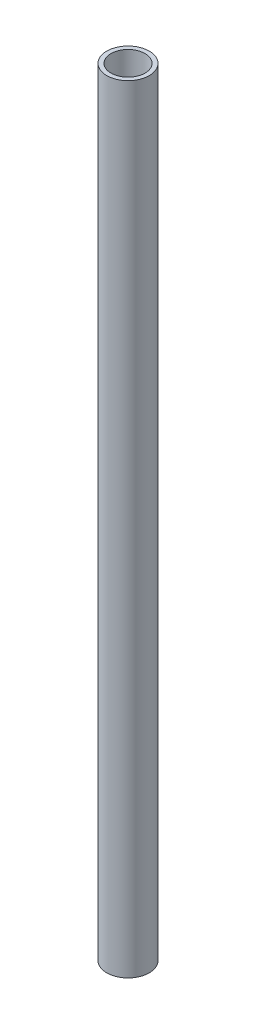
ISO-10303-21;
HEADER;
FILE_DESCRIPTION(('STEP AP214'),'2;1');
FILE_NAME('part.step','',(''),(''),'','','');
FILE_SCHEMA(('AUTOMOTIVE_DESIGN { 1 0 10303 214 1 1 1 1 }'));
ENDSEC;
DATA;
#1=APPLICATION_CONTEXT('core data for automotive mechanical design processes');
#2=APPLICATION_PROTOCOL_DEFINITION('international standard','automotive_design',2000,#1);
#3=PRODUCT_CONTEXT('',#1,'mechanical');
#4=PRODUCT('Part','Part','',(#3));
#5=PRODUCT_RELATED_PRODUCT_CATEGORY('part','',(#4));
#6=PRODUCT_DEFINITION_FORMATION('','',#4);
#7=PRODUCT_DEFINITION_CONTEXT('part definition',#1,'design');
#8=PRODUCT_DEFINITION('design','',#6,#7);
#9=PRODUCT_DEFINITION_SHAPE('','',#8);
#10=(LENGTH_UNIT() NAMED_UNIT(*) SI_UNIT(.MILLI.,.METRE.));
#11=(NAMED_UNIT(*) PLANE_ANGLE_UNIT() SI_UNIT($,.RADIAN.));
#12=(NAMED_UNIT(*) SI_UNIT($,.STERADIAN.) SOLID_ANGLE_UNIT());
#13=UNCERTAINTY_MEASURE_WITH_UNIT(LENGTH_MEASURE(1.E-05),#10,'distance_accuracy_value','');
#14=(GEOMETRIC_REPRESENTATION_CONTEXT(3) GLOBAL_UNCERTAINTY_ASSIGNED_CONTEXT((#13)) GLOBAL_UNIT_ASSIGNED_CONTEXT((#10,
#11,#12)) REPRESENTATION_CONTEXT('',''));
#15=CARTESIAN_POINT('',(0.,0.,0.));
#16=DIRECTION('',(0.,0.,1.));
#17=DIRECTION('',(1.,0.,0.));
#18=AXIS2_PLACEMENT_3D('',#15,#16,#17);
#19=CARTESIAN_POINT('',(0.,914.4,0.));
#20=DIRECTION('',(0.,1.,0.));
#21=DIRECTION('',(0.,0.,1.));
#22=AXIS2_PLACEMENT_3D('',#19,#20,#21);
#23=PLANE('',#22);
#24=CARTESIAN_POINT('',(0.,914.4,0.));
#25=DIRECTION('',(0.,1.,0.));
#26=DIRECTION('',(0.,0.,1.));
#27=AXIS2_PLACEMENT_3D('',#24,#25,#26);
#28=CIRCLE('',#27,25.);
#29=CARTESIAN_POINT('',(0.,914.4,-25.));
#30=VERTEX_POINT('',#29);
#31=EDGE_CURVE('E10',#30,#30,#28,.T.);
#32=ORIENTED_EDGE('',*,*,#31,.T.);
#33=EDGE_LOOP('',(#32));
#34=FACE_BOUND('',#33,.T.);
#35=CARTESIAN_POINT('',(0.,914.4,0.));
#36=DIRECTION('',(0.,1.,0.));
#37=DIRECTION('',(0.,0.,1.));
#38=AXIS2_PLACEMENT_3D('',#35,#36,#37);
#39=CIRCLE('',#38,20.);
#40=CARTESIAN_POINT('',(0.,914.4,-20.));
#41=VERTEX_POINT('',#40);
#42=EDGE_CURVE('E57',#41,#41,#39,.T.);
#43=ORIENTED_EDGE('',*,*,#42,.F.);
#44=EDGE_LOOP('',(#43));
#45=FACE_BOUND('',#44,.T.);
#46=ADVANCED_FACE('F43',(#34,#45),#23,.T.);
#47=CARTESIAN_POINT('',(0.,0.,0.));
#48=DIRECTION('',(0.,1.,0.));
#49=DIRECTION('',(0.,0.,1.));
#50=AXIS2_PLACEMENT_3D('',#47,#48,#49);
#51=PLANE('',#50);
#52=CARTESIAN_POINT('',(0.,0.,0.));
#53=DIRECTION('',(0.,1.,0.));
#54=DIRECTION('',(0.,0.,1.));
#55=AXIS2_PLACEMENT_3D('',#52,#53,#54);
#56=CIRCLE('',#55,25.);
#57=CARTESIAN_POINT('',(0.,-1.11022302462516E-13,-25.));
#58=VERTEX_POINT('',#57);
#59=EDGE_CURVE('E50',#58,#58,#56,.T.);
#60=ORIENTED_EDGE('',*,*,#59,.F.);
#61=EDGE_LOOP('',(#60));
#62=FACE_BOUND('',#61,.T.);
#63=CARTESIAN_POINT('',(0.,0.,0.));
#64=DIRECTION('',(0.,1.,0.));
#65=DIRECTION('',(0.,0.,1.));
#66=AXIS2_PLACEMENT_3D('',#63,#64,#65);
#67=CIRCLE('',#66,20.);
#68=CARTESIAN_POINT('',(0.,-1.11022302462516E-13,-20.));
#69=VERTEX_POINT('',#68);
#70=EDGE_CURVE('E59',#69,#69,#67,.T.);
#71=ORIENTED_EDGE('',*,*,#70,.T.);
#72=EDGE_LOOP('',(#71));
#73=FACE_BOUND('',#72,.T.);
#74=ADVANCED_FACE('F68',(#62,#73),#51,.F.);
#75=CARTESIAN_POINT('',(0.,914.4,0.));
#76=DIRECTION('',(0.,-1.,0.));
#77=DIRECTION('',(0.,0.,-1.));
#78=AXIS2_PLACEMENT_3D('',#75,#76,#77);
#79=CYLINDRICAL_SURFACE('',#78,25.);
#80=CARTESIAN_POINT('',(0.,914.4,-25.));
#81=CARTESIAN_POINT('',(0.,904.875,-25.));
#82=CARTESIAN_POINT('',(0.,895.35,-25.));
#83=CARTESIAN_POINT('',(0.,876.3,-25.));
#84=CARTESIAN_POINT('',(0.,866.775,-25.));
#85=CARTESIAN_POINT('',(0.,847.725,-25.));
#86=CARTESIAN_POINT('',(0.,838.2,-25.));
#87=CARTESIAN_POINT('',(0.,819.15,-25.));
#88=CARTESIAN_POINT('',(0.,809.625,-25.));
#89=CARTESIAN_POINT('',(0.,790.575,-25.));
#90=CARTESIAN_POINT('',(0.,781.05,-25.));
#91=CARTESIAN_POINT('',(0.,762.,-25.));
#92=CARTESIAN_POINT('',(0.,752.475,-25.));
#93=CARTESIAN_POINT('',(0.,733.425,-25.));
#94=CARTESIAN_POINT('',(0.,723.9,-25.));
#95=CARTESIAN_POINT('',(0.,704.85,-25.));
#96=CARTESIAN_POINT('',(0.,695.325,-25.));
#97=CARTESIAN_POINT('',(0.,676.275,-25.));
#98=CARTESIAN_POINT('',(0.,666.75,-25.));
#99=CARTESIAN_POINT('',(0.,647.7,-25.));
#100=CARTESIAN_POINT('',(0.,638.175,-25.));
#101=CARTESIAN_POINT('',(0.,619.125,-25.));
#102=CARTESIAN_POINT('',(0.,609.6,-25.));
#103=CARTESIAN_POINT('',(0.,590.55,-25.));
#104=CARTESIAN_POINT('',(0.,581.025,-25.));
#105=CARTESIAN_POINT('',(0.,561.975,-25.));
#106=CARTESIAN_POINT('',(0.,552.45,-25.));
#107=CARTESIAN_POINT('',(0.,533.4,-25.));
#108=CARTESIAN_POINT('',(0.,523.875,-25.));
#109=CARTESIAN_POINT('',(0.,504.825,-25.));
#110=CARTESIAN_POINT('',(0.,495.3,-25.));
#111=CARTESIAN_POINT('',(0.,476.25,-25.));
#112=CARTESIAN_POINT('',(0.,466.725,-25.));
#113=CARTESIAN_POINT('',(0.,447.675,-25.));
#114=CARTESIAN_POINT('',(0.,438.15,-25.));
#115=CARTESIAN_POINT('',(0.,419.1,-25.));
#116=CARTESIAN_POINT('',(0.,409.575,-25.));
#117=CARTESIAN_POINT('',(0.,390.525,-25.));
#118=CARTESIAN_POINT('',(0.,381.,-25.));
#119=CARTESIAN_POINT('',(0.,361.95,-25.));
#120=CARTESIAN_POINT('',(0.,352.425,-25.));
#121=CARTESIAN_POINT('',(0.,333.375,-25.));
#122=CARTESIAN_POINT('',(0.,323.85,-25.));
#123=CARTESIAN_POINT('',(0.,304.8,-25.));
#124=CARTESIAN_POINT('',(0.,295.275,-25.));
#125=CARTESIAN_POINT('',(0.,276.225,-25.));
#126=CARTESIAN_POINT('',(0.,266.7,-25.));
#127=CARTESIAN_POINT('',(0.,247.65,-25.));
#128=CARTESIAN_POINT('',(0.,238.125,-25.));
#129=CARTESIAN_POINT('',(0.,219.075,-25.));
#130=CARTESIAN_POINT('',(0.,209.55,-25.));
#131=CARTESIAN_POINT('',(0.,190.5,-25.));
#132=CARTESIAN_POINT('',(0.,180.975,-25.));
#133=CARTESIAN_POINT('',(0.,161.925,-25.));
#134=CARTESIAN_POINT('',(0.,152.4,-25.));
#135=CARTESIAN_POINT('',(0.,133.35,-25.));
#136=CARTESIAN_POINT('',(0.,123.825,-25.));
#137=CARTESIAN_POINT('',(0.,104.775,-25.));
#138=CARTESIAN_POINT('',(0.,95.2499999999999,-25.));
#139=CARTESIAN_POINT('',(0.,76.1999999999999,-25.));
#140=CARTESIAN_POINT('',(0.,66.6749999999999,-25.));
#141=CARTESIAN_POINT('',(0.,47.6249999999999,-25.));
#142=CARTESIAN_POINT('',(0.,38.0999999999999,-25.));
#143=CARTESIAN_POINT('',(0.,19.0499999999999,-25.));
#144=CARTESIAN_POINT('',(0.,9.52499999999988,-25.));
#145=CARTESIAN_POINT('',(0.,-1.11022302462516E-13,-25.));
#146=B_SPLINE_CURVE_WITH_KNOTS('',3,(#80,#81,#82,#83,#84,#85,#86,#87,#88,#89,#90,#91,#92,#93,
#94,#95,#96,#97,#98,#99,#100,#101,#102,#103,#104,#105,#106,#107,#108,#109,#110,#111,#112,#113,
#114,#115,#116,#117,#118,#119,#120,#121,#122,#123,#124,#125,#126,#127,#128,#129,#130,#131,#132,
#133,#134,#135,#136,#137,#138,#139,#140,#141,#142,#143,#144,#145),.UNSPECIFIED.,.F.,.F.,(4,2,2,
2,2,2,2,2,2,2,2,2,2,2,2,2,2,2,2,2,2,2,2,2,2,2,2,2,2,2,2,2,4),(0.,28.5749999999999,
57.1499999999999,85.7249999999999,114.3,142.875,171.45,200.025,228.6,257.175,285.75,314.325,
342.9,371.475,400.05,428.625,457.2,485.775,514.35,542.925,571.5,600.075,628.65,657.225,685.8,
714.375,742.95,771.525,800.1,828.675,857.25,885.825,914.4),.UNSPECIFIED.);
#147=EDGE_CURVE('BSEAM44',#30,#58,#146,.T.);
#148=ORIENTED_EDGE('',*,*,#31,.F.);
#149=ORIENTED_EDGE('',*,*,#59,.T.);
#150=ORIENTED_EDGE('',*,*,#147,.T.);
#151=ORIENTED_EDGE('',*,*,#147,.F.);
#152=EDGE_LOOP('',(#148,#150,#149,#151));
#153=FACE_BOUND('',#152,.T.);
#154=ADVANCED_FACE('F44',(#153),#79,.T.);
#155=CARTESIAN_POINT('',(0.,914.4,0.));
#156=DIRECTION('',(0.,-1.,0.));
#157=DIRECTION('',(0.,0.,-1.));
#158=AXIS2_PLACEMENT_3D('',#155,#156,#157);
#159=CYLINDRICAL_SURFACE('',#158,20.);
#160=CARTESIAN_POINT('',(0.,914.4,-20.));
#161=CARTESIAN_POINT('',(0.,904.875,-20.));
#162=CARTESIAN_POINT('',(0.,895.35,-20.));
#163=CARTESIAN_POINT('',(0.,876.3,-20.));
#164=CARTESIAN_POINT('',(0.,866.775,-20.));
#165=CARTESIAN_POINT('',(0.,847.725,-20.));
#166=CARTESIAN_POINT('',(0.,838.2,-20.));
#167=CARTESIAN_POINT('',(0.,819.15,-20.));
#168=CARTESIAN_POINT('',(0.,809.625,-20.));
#169=CARTESIAN_POINT('',(0.,790.575,-20.));
#170=CARTESIAN_POINT('',(0.,781.05,-20.));
#171=CARTESIAN_POINT('',(0.,762.,-20.));
#172=CARTESIAN_POINT('',(0.,752.475,-20.));
#173=CARTESIAN_POINT('',(0.,733.425,-20.));
#174=CARTESIAN_POINT('',(0.,723.9,-20.));
#175=CARTESIAN_POINT('',(0.,704.85,-20.));
#176=CARTESIAN_POINT('',(0.,695.325,-20.));
#177=CARTESIAN_POINT('',(0.,676.275,-20.));
#178=CARTESIAN_POINT('',(0.,666.75,-20.));
#179=CARTESIAN_POINT('',(0.,647.7,-20.));
#180=CARTESIAN_POINT('',(0.,638.175,-20.));
#181=CARTESIAN_POINT('',(0.,619.125,-20.));
#182=CARTESIAN_POINT('',(0.,609.6,-20.));
#183=CARTESIAN_POINT('',(0.,590.55,-20.));
#184=CARTESIAN_POINT('',(0.,581.025,-20.));
#185=CARTESIAN_POINT('',(0.,561.975,-20.));
#186=CARTESIAN_POINT('',(0.,552.45,-20.));
#187=CARTESIAN_POINT('',(0.,533.4,-20.));
#188=CARTESIAN_POINT('',(0.,523.875,-20.));
#189=CARTESIAN_POINT('',(0.,504.825,-20.));
#190=CARTESIAN_POINT('',(0.,495.3,-20.));
#191=CARTESIAN_POINT('',(0.,476.25,-20.));
#192=CARTESIAN_POINT('',(0.,466.725,-20.));
#193=CARTESIAN_POINT('',(0.,447.675,-20.));
#194=CARTESIAN_POINT('',(0.,438.15,-20.));
#195=CARTESIAN_POINT('',(0.,419.1,-20.));
#196=CARTESIAN_POINT('',(0.,409.575,-20.));
#197=CARTESIAN_POINT('',(0.,390.525,-20.));
#198=CARTESIAN_POINT('',(0.,381.,-20.));
#199=CARTESIAN_POINT('',(0.,361.95,-20.));
#200=CARTESIAN_POINT('',(0.,352.425,-20.));
#201=CARTESIAN_POINT('',(0.,333.375,-20.));
#202=CARTESIAN_POINT('',(0.,323.85,-20.));
#203=CARTESIAN_POINT('',(0.,304.8,-20.));
#204=CARTESIAN_POINT('',(0.,295.275,-20.));
#205=CARTESIAN_POINT('',(0.,276.225,-20.));
#206=CARTESIAN_POINT('',(0.,266.7,-20.));
#207=CARTESIAN_POINT('',(0.,247.65,-20.));
#208=CARTESIAN_POINT('',(0.,238.125,-20.));
#209=CARTESIAN_POINT('',(0.,219.075,-20.));
#210=CARTESIAN_POINT('',(0.,209.55,-20.));
#211=CARTESIAN_POINT('',(0.,190.5,-20.));
#212=CARTESIAN_POINT('',(0.,180.975,-20.));
#213=CARTESIAN_POINT('',(0.,161.925,-20.));
#214=CARTESIAN_POINT('',(0.,152.4,-20.));
#215=CARTESIAN_POINT('',(0.,133.35,-20.));
#216=CARTESIAN_POINT('',(0.,123.825,-20.));
#217=CARTESIAN_POINT('',(0.,104.775,-20.));
#218=CARTESIAN_POINT('',(0.,95.2499999999999,-20.));
#219=CARTESIAN_POINT('',(0.,76.1999999999999,-20.));
#220=CARTESIAN_POINT('',(0.,66.6749999999999,-20.));
#221=CARTESIAN_POINT('',(0.,47.6249999999999,-20.));
#222=CARTESIAN_POINT('',(0.,38.0999999999999,-20.));
#223=CARTESIAN_POINT('',(0.,19.0499999999999,-20.));
#224=CARTESIAN_POINT('',(0.,9.52499999999988,-20.));
#225=CARTESIAN_POINT('',(0.,-1.11022302462516E-13,-20.));
#226=B_SPLINE_CURVE_WITH_KNOTS('',3,(#160,#161,#162,#163,#164,#165,#166,#167,#168,#169,#170,
#171,#172,#173,#174,#175,#176,#177,#178,#179,#180,#181,#182,#183,#184,#185,#186,#187,#188,#189,
#190,#191,#192,#193,#194,#195,#196,#197,#198,#199,#200,#201,#202,#203,#204,#205,#206,#207,#208,
#209,#210,#211,#212,#213,#214,#215,#216,#217,#218,#219,#220,#221,#222,#223,#224,#225),
.UNSPECIFIED.,.F.,.F.,(4,2,2,2,2,2,2,2,2,2,2,2,2,2,2,2,2,2,2,2,2,2,2,2,2,2,2,2,2,2,2,2,4),(0.,
28.575,57.15,85.7250000000001,114.3,142.875,171.45,200.025,228.6,257.175,285.75,314.325,342.9,
371.475,400.05,428.625,457.2,485.775,514.35,542.925,571.5,600.075,628.65,657.225,685.8,714.375,
742.95,771.525,800.1,828.675,857.25,885.825,914.4),.UNSPECIFIED.);
#227=EDGE_CURVE('BSEAM67',#41,#69,#226,.T.);
#228=ORIENTED_EDGE('',*,*,#42,.T.);
#229=ORIENTED_EDGE('',*,*,#70,.F.);
#230=ORIENTED_EDGE('',*,*,#227,.T.);
#231=ORIENTED_EDGE('',*,*,#227,.F.);
#232=EDGE_LOOP('',(#228,#230,#229,#231));
#233=FACE_BOUND('',#232,.T.);
#234=ADVANCED_FACE('F67',(#233),#159,.F.);
#235=CLOSED_SHELL('',(#46,#74,#154,#234));
#236=MANIFOLD_SOLID_BREP('B2',#235);
#237=ADVANCED_BREP_SHAPE_REPRESENTATION('',(#18,#236),#14);
#238=SHAPE_DEFINITION_REPRESENTATION(#9,#237);
ENDSEC;
END-ISO-10303-21;
